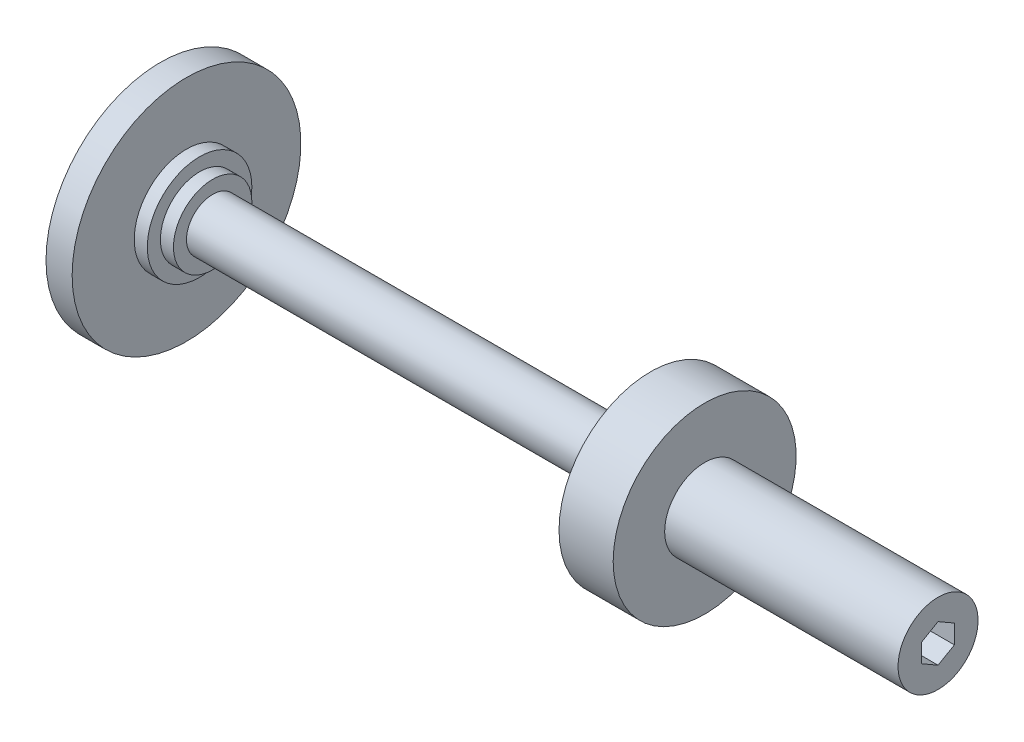
ISO-10303-21;
HEADER;
FILE_DESCRIPTION(('STEP AP214'),'2;1');
FILE_NAME('part.step','',(''),(''),'','','');
FILE_SCHEMA(('AUTOMOTIVE_DESIGN { 1 0 10303 214 1 1 1 1 }'));
ENDSEC;
DATA;
#1=APPLICATION_CONTEXT('core data for automotive mechanical design processes');
#2=APPLICATION_PROTOCOL_DEFINITION('international standard','automotive_design',2000,#1);
#3=PRODUCT_CONTEXT('',#1,'mechanical');
#4=PRODUCT('Part','Part','',(#3));
#5=PRODUCT_RELATED_PRODUCT_CATEGORY('part','',(#4));
#6=PRODUCT_DEFINITION_FORMATION('','',#4);
#7=PRODUCT_DEFINITION_CONTEXT('part definition',#1,'design');
#8=PRODUCT_DEFINITION('design','',#6,#7);
#9=PRODUCT_DEFINITION_SHAPE('','',#8);
#10=(LENGTH_UNIT() NAMED_UNIT(*) SI_UNIT(.MILLI.,.METRE.));
#11=(NAMED_UNIT(*) PLANE_ANGLE_UNIT() SI_UNIT($,.RADIAN.));
#12=(NAMED_UNIT(*) SI_UNIT($,.STERADIAN.) SOLID_ANGLE_UNIT());
#13=UNCERTAINTY_MEASURE_WITH_UNIT(LENGTH_MEASURE(1.E-05),#10,'distance_accuracy_value','');
#14=(GEOMETRIC_REPRESENTATION_CONTEXT(3) GLOBAL_UNCERTAINTY_ASSIGNED_CONTEXT((#13)) GLOBAL_UNIT_ASSIGNED_CONTEXT((#10,
#11,#12)) REPRESENTATION_CONTEXT('',''));
#15=CARTESIAN_POINT('',(0.,0.,0.));
#16=DIRECTION('',(0.,0.,1.));
#17=DIRECTION('',(1.,0.,0.));
#18=AXIS2_PLACEMENT_3D('',#15,#16,#17);
#19=CARTESIAN_POINT('',(-212.725,19.05,0.));
#20=DIRECTION('',(1.,0.,0.));
#21=DIRECTION('',(0.,0.,-1.));
#22=AXIS2_PLACEMENT_3D('',#19,#20,#21);
#23=PLANE('',#22);
#24=CARTESIAN_POINT('',(-212.725,0.,0.));
#25=DIRECTION('',(1.,0.,0.));
#26=DIRECTION('',(0.,0.,-1.));
#27=AXIS2_PLACEMENT_3D('',#24,#25,#26);
#28=CIRCLE('',#27,19.05);
#29=CARTESIAN_POINT('',(-212.725,0.,-19.05));
#30=VERTEX_POINT('',#29);
#31=EDGE_CURVE('E78',#30,#30,#28,.T.);
#32=ORIENTED_EDGE('',*,*,#31,.T.);
#33=EDGE_LOOP('',(#32));
#34=FACE_BOUND('',#33,.T.);
#35=CARTESIAN_POINT('',(-212.725,0.,0.));
#36=DIRECTION('',(1.,0.,0.));
#37=DIRECTION('',(0.,0.,-1.));
#38=AXIS2_PLACEMENT_3D('',#35,#36,#37);
#39=CIRCLE('',#38,12.7);
#40=CARTESIAN_POINT('',(-212.725,0.,-12.7));
#41=VERTEX_POINT('',#40);
#42=EDGE_CURVE('E11',#41,#41,#39,.T.);
#43=ORIENTED_EDGE('',*,*,#42,.F.);
#44=EDGE_LOOP('',(#43));
#45=FACE_BOUND('',#44,.T.);
#46=ADVANCED_FACE('F49',(#34,#45),#23,.T.);
#47=CARTESIAN_POINT('',(-254.,0.,0.));
#48=DIRECTION('',(1.,0.,0.));
#49=DIRECTION('',(0.,0.,-1.));
#50=AXIS2_PLACEMENT_3D('',#47,#48,#49);
#51=CYLINDRICAL_SURFACE('',#50,12.7);
#52=ORIENTED_EDGE('',*,*,#42,.T.);
#53=EDGE_LOOP('',(#52));
#54=FACE_BOUND('',#53,.T.);
#55=CARTESIAN_POINT('',(-225.425,0.,0.));
#56=DIRECTION('',(1.,0.,0.));
#57=DIRECTION('',(0.,0.,-1.));
#58=AXIS2_PLACEMENT_3D('',#55,#56,#57);
#59=CIRCLE('',#58,12.7);
#60=CARTESIAN_POINT('',(-225.425,0.,-12.7));
#61=VERTEX_POINT('',#60);
#62=EDGE_CURVE('E56',#61,#61,#59,.T.);
#63=ORIENTED_EDGE('',*,*,#62,.F.);
#64=EDGE_LOOP('',(#63));
#65=FACE_BOUND('',#64,.T.);
#66=ADVANCED_FACE('F99',(#54,#65),#51,.F.);
#67=CARTESIAN_POINT('',(-225.425,12.7000000000002,0.));
#68=DIRECTION('',(-1.,0.,0.));
#69=DIRECTION('',(0.,0.,1.));
#70=AXIS2_PLACEMENT_3D('',#67,#68,#69);
#71=PLANE('',#70);
#72=ORIENTED_EDGE('',*,*,#62,.T.);
#73=EDGE_LOOP('',(#72));
#74=FACE_BOUND('',#73,.T.);
#75=CARTESIAN_POINT('',(-225.425,0.,0.));
#76=DIRECTION('',(1.,0.,0.));
#77=DIRECTION('',(0.,0.,-1.));
#78=AXIS2_PLACEMENT_3D('',#75,#76,#77);
#79=CIRCLE('',#78,25.4);
#80=CARTESIAN_POINT('',(-225.425,0.,-25.4));
#81=VERTEX_POINT('',#80);
#82=EDGE_CURVE('E62',#81,#81,#79,.T.);
#83=ORIENTED_EDGE('',*,*,#82,.F.);
#84=EDGE_LOOP('',(#83));
#85=FACE_BOUND('',#84,.T.);
#86=ADVANCED_FACE('F104',(#74,#85),#71,.T.);
#87=CARTESIAN_POINT('',(-254.,0.,0.));
#88=DIRECTION('',(1.,0.,0.));
#89=DIRECTION('',(0.,0.,-1.));
#90=AXIS2_PLACEMENT_3D('',#87,#88,#89);
#91=CYLINDRICAL_SURFACE('',#90,25.4);
#92=ORIENTED_EDGE('',*,*,#82,.T.);
#93=EDGE_LOOP('',(#92));
#94=FACE_BOUND('',#93,.T.);
#95=CARTESIAN_POINT('',(-219.075,0.,0.));
#96=DIRECTION('',(1.,0.,0.));
#97=DIRECTION('',(0.,0.,-1.));
#98=AXIS2_PLACEMENT_3D('',#95,#96,#97);
#99=CIRCLE('',#98,25.4);
#100=CARTESIAN_POINT('',(-219.075,0.,-25.4));
#101=VERTEX_POINT('',#100);
#102=EDGE_CURVE('E68',#101,#101,#99,.T.);
#103=ORIENTED_EDGE('',*,*,#102,.F.);
#104=EDGE_LOOP('',(#103));
#105=FACE_BOUND('',#104,.T.);
#106=ADVANCED_FACE('F95',(#94,#105),#91,.T.);
#107=CARTESIAN_POINT('',(-219.075,25.4000000000005,0.));
#108=DIRECTION('',(1.,0.,0.));
#109=DIRECTION('',(0.,0.,-1.));
#110=AXIS2_PLACEMENT_3D('',#107,#108,#109);
#111=PLANE('',#110);
#112=ORIENTED_EDGE('',*,*,#102,.T.);
#113=EDGE_LOOP('',(#112));
#114=FACE_BOUND('',#113,.T.);
#115=CARTESIAN_POINT('',(-219.075,0.,0.));
#116=DIRECTION('',(1.,0.,0.));
#117=DIRECTION('',(0.,0.,-1.));
#118=AXIS2_PLACEMENT_3D('',#115,#116,#117);
#119=CIRCLE('',#118,19.05);
#120=CARTESIAN_POINT('',(-219.075,0.,-19.05));
#121=VERTEX_POINT('',#120);
#122=EDGE_CURVE('E74',#121,#121,#119,.T.);
#123=ORIENTED_EDGE('',*,*,#122,.F.);
#124=EDGE_LOOP('',(#123));
#125=FACE_BOUND('',#124,.T.);
#126=ADVANCED_FACE('F88',(#114,#125),#111,.T.);
#127=CARTESIAN_POINT('',(-254.,0.,0.));
#128=DIRECTION('',(1.,0.,0.));
#129=DIRECTION('',(0.,0.,-1.));
#130=AXIS2_PLACEMENT_3D('',#127,#128,#129);
#131=CYLINDRICAL_SURFACE('',#130,19.05);
#132=ORIENTED_EDGE('',*,*,#122,.T.);
#133=EDGE_LOOP('',(#132));
#134=FACE_BOUND('',#133,.T.);
#135=ORIENTED_EDGE('',*,*,#31,.F.);
#136=EDGE_LOOP('',(#135));
#137=FACE_BOUND('',#136,.T.);
#138=ADVANCED_FACE('F86',(#134,#137),#131,.T.);
#139=CLOSED_SHELL('',(#46,#66,#86,#106,#126,#138));
#140=MANIFOLD_SOLID_BREP('B2',#139);
#141=CARTESIAN_POINT('',(-254.,0.,0.));
#142=DIRECTION('',(1.,0.,0.));
#143=DIRECTION('',(0.,0.,-1.));
#144=AXIS2_PLACEMENT_3D('',#141,#142,#143);
#145=CYLINDRICAL_SURFACE('',#144,12.7);
#146=CARTESIAN_POINT('',(-238.125,0.,0.));
#147=DIRECTION('',(1.,0.,0.));
#148=DIRECTION('',(0.,0.,-1.));
#149=AXIS2_PLACEMENT_3D('',#146,#147,#148);
#150=CIRCLE('',#149,12.7);
#151=CARTESIAN_POINT('',(-238.125,0.,-12.7));
#152=VERTEX_POINT('',#151);
#153=EDGE_CURVE('E48',#152,#152,#150,.T.);
#154=ORIENTED_EDGE('',*,*,#153,.T.);
#155=EDGE_LOOP('',(#154));
#156=FACE_BOUND('',#155,.T.);
#157=CARTESIAN_POINT('',(-250.825,0.,0.));
#158=DIRECTION('',(1.,0.,0.));
#159=DIRECTION('',(0.,0.,-1.));
#160=AXIS2_PLACEMENT_3D('',#157,#158,#159);
#161=CIRCLE('',#160,12.7);
#162=CARTESIAN_POINT('',(-250.825,0.,-12.7));
#163=VERTEX_POINT('',#162);
#164=EDGE_CURVE('E177',#163,#163,#161,.T.);
#165=ORIENTED_EDGE('',*,*,#164,.F.);
#166=EDGE_LOOP('',(#165));
#167=FACE_BOUND('',#166,.T.);
#168=ADVANCED_FACE('F148',(#156,#167),#145,.F.);
#169=CARTESIAN_POINT('',(-238.125,12.7000000000002,0.));
#170=DIRECTION('',(1.,0.,0.));
#171=DIRECTION('',(0.,0.,-1.));
#172=AXIS2_PLACEMENT_3D('',#169,#170,#171);
#173=PLANE('',#172);
#174=CARTESIAN_POINT('',(-238.125,0.,0.));
#175=DIRECTION('',(1.,0.,0.));
#176=DIRECTION('',(0.,0.,-1.));
#177=AXIS2_PLACEMENT_3D('',#174,#175,#176);
#178=CIRCLE('',#177,25.4);
#179=CARTESIAN_POINT('',(-238.125,0.,-25.4));
#180=VERTEX_POINT('',#179);
#181=EDGE_CURVE('E155',#180,#180,#178,.T.);
#182=ORIENTED_EDGE('',*,*,#181,.T.);
#183=EDGE_LOOP('',(#182));
#184=FACE_BOUND('',#183,.T.);
#185=ORIENTED_EDGE('',*,*,#153,.F.);
#186=EDGE_LOOP('',(#185));
#187=FACE_BOUND('',#186,.T.);
#188=ADVANCED_FACE('F187',(#184,#187),#173,.T.);
#189=CARTESIAN_POINT('',(-254.,0.,0.));
#190=DIRECTION('',(1.,0.,0.));
#191=DIRECTION('',(0.,0.,-1.));
#192=AXIS2_PLACEMENT_3D('',#189,#190,#191);
#193=CYLINDRICAL_SURFACE('',#192,25.4);
#194=CARTESIAN_POINT('',(-244.475,0.,0.));
#195=DIRECTION('',(1.,0.,0.));
#196=DIRECTION('',(0.,0.,-1.));
#197=AXIS2_PLACEMENT_3D('',#194,#195,#196);
#198=CIRCLE('',#197,25.4);
#199=CARTESIAN_POINT('',(-244.475,0.,-25.4));
#200=VERTEX_POINT('',#199);
#201=EDGE_CURVE('E161',#200,#200,#198,.T.);
#202=ORIENTED_EDGE('',*,*,#201,.T.);
#203=EDGE_LOOP('',(#202));
#204=FACE_BOUND('',#203,.T.);
#205=ORIENTED_EDGE('',*,*,#181,.F.);
#206=EDGE_LOOP('',(#205));
#207=FACE_BOUND('',#206,.T.);
#208=ADVANCED_FACE('F192',(#204,#207),#193,.T.);
#209=CARTESIAN_POINT('',(-244.475,25.4000000000005,0.));
#210=DIRECTION('',(-1.,0.,0.));
#211=DIRECTION('',(0.,0.,1.));
#212=AXIS2_PLACEMENT_3D('',#209,#210,#211);
#213=PLANE('',#212);
#214=CARTESIAN_POINT('',(-244.475,0.,0.));
#215=DIRECTION('',(1.,0.,0.));
#216=DIRECTION('',(0.,0.,-1.));
#217=AXIS2_PLACEMENT_3D('',#214,#215,#216);
#218=CIRCLE('',#217,19.05);
#219=CARTESIAN_POINT('',(-244.475,0.,-19.05));
#220=VERTEX_POINT('',#219);
#221=EDGE_CURVE('E167',#220,#220,#218,.T.);
#222=ORIENTED_EDGE('',*,*,#221,.T.);
#223=EDGE_LOOP('',(#222));
#224=FACE_BOUND('',#223,.T.);
#225=ORIENTED_EDGE('',*,*,#201,.F.);
#226=EDGE_LOOP('',(#225));
#227=FACE_BOUND('',#226,.T.);
#228=ADVANCED_FACE('F197',(#224,#227),#213,.T.);
#229=CARTESIAN_POINT('',(-254.,0.,0.));
#230=DIRECTION('',(1.,0.,0.));
#231=DIRECTION('',(0.,0.,-1.));
#232=AXIS2_PLACEMENT_3D('',#229,#230,#231);
#233=CYLINDRICAL_SURFACE('',#232,19.05);
#234=CARTESIAN_POINT('',(-250.825,0.,0.));
#235=DIRECTION('',(1.,0.,0.));
#236=DIRECTION('',(0.,0.,-1.));
#237=AXIS2_PLACEMENT_3D('',#234,#235,#236);
#238=CIRCLE('',#237,19.05);
#239=CARTESIAN_POINT('',(-250.825,0.,-19.05));
#240=VERTEX_POINT('',#239);
#241=EDGE_CURVE('E173',#240,#240,#238,.T.);
#242=ORIENTED_EDGE('',*,*,#241,.T.);
#243=EDGE_LOOP('',(#242));
#244=FACE_BOUND('',#243,.T.);
#245=ORIENTED_EDGE('',*,*,#221,.F.);
#246=EDGE_LOOP('',(#245));
#247=FACE_BOUND('',#246,.T.);
#248=ADVANCED_FACE('F204',(#244,#247),#233,.T.);
#249=CARTESIAN_POINT('',(-250.825,19.05,0.));
#250=DIRECTION('',(-1.,0.,0.));
#251=DIRECTION('',(0.,0.,1.));
#252=AXIS2_PLACEMENT_3D('',#249,#250,#251);
#253=PLANE('',#252);
#254=ORIENTED_EDGE('',*,*,#164,.T.);
#255=EDGE_LOOP('',(#254));
#256=FACE_BOUND('',#255,.T.);
#257=ORIENTED_EDGE('',*,*,#241,.F.);
#258=EDGE_LOOP('',(#257));
#259=FACE_BOUND('',#258,.T.);
#260=ADVANCED_FACE('F183',(#256,#259),#253,.T.);
#261=CLOSED_SHELL('',(#168,#188,#208,#228,#248,#260));
#262=MANIFOLD_SOLID_BREP('B6',#261);
#263=CARTESIAN_POINT('',(-225.425,0.,0.));
#264=DIRECTION('',(-1.,0.,0.));
#265=DIRECTION('',(0.,0.,1.));
#266=AXIS2_PLACEMENT_3D('',#263,#264,#265);
#267=CYLINDRICAL_SURFACE('',#266,55.5625);
#268=CARTESIAN_POINT('',(-225.425,0.,0.));
#269=DIRECTION('',(-1.,0.,0.));
#270=DIRECTION('',(0.,0.,1.));
#271=AXIS2_PLACEMENT_3D('',#268,#269,#270);
#272=CIRCLE('',#271,55.5625);
#273=CARTESIAN_POINT('',(-225.425,0.,55.5625000000001));
#274=VERTEX_POINT('',#273);
#275=EDGE_CURVE('E147',#274,#274,#272,.T.);
#276=ORIENTED_EDGE('',*,*,#275,.T.);
#277=EDGE_LOOP('',(#276));
#278=FACE_BOUND('',#277,.T.);
#279=CARTESIAN_POINT('',(-238.125,0.,0.));
#280=DIRECTION('',(-1.,0.,0.));
#281=DIRECTION('',(0.,0.,1.));
#282=AXIS2_PLACEMENT_3D('',#279,#280,#281);
#283=CIRCLE('',#282,55.5625);
#284=CARTESIAN_POINT('',(-238.125,0.,55.5625000000001));
#285=VERTEX_POINT('',#284);
#286=EDGE_CURVE('E251',#285,#285,#283,.T.);
#287=ORIENTED_EDGE('',*,*,#286,.F.);
#288=EDGE_LOOP('',(#287));
#289=FACE_BOUND('',#288,.T.);
#290=ADVANCED_FACE('F248',(#278,#289),#267,.T.);
#291=CARTESIAN_POINT('',(-225.425,0.,0.));
#292=DIRECTION('',(-1.,0.,0.));
#293=DIRECTION('',(0.,0.,1.));
#294=AXIS2_PLACEMENT_3D('',#291,#292,#293);
#295=PLANE('',#294);
#296=CARTESIAN_POINT('',(-225.425,0.,0.));
#297=DIRECTION('',(-1.,0.,0.));
#298=DIRECTION('',(0.,0.,1.));
#299=AXIS2_PLACEMENT_3D('',#296,#297,#298);
#300=CIRCLE('',#299,12.7);
#301=CARTESIAN_POINT('',(-225.425,0.,12.7));
#302=VERTEX_POINT('',#301);
#303=EDGE_CURVE('E261',#302,#302,#300,.T.);
#304=ORIENTED_EDGE('',*,*,#303,.T.);
#305=EDGE_LOOP('',(#304));
#306=FACE_BOUND('',#305,.T.);
#307=ORIENTED_EDGE('',*,*,#275,.F.);
#308=EDGE_LOOP('',(#307));
#309=FACE_BOUND('',#308,.T.);
#310=ADVANCED_FACE('F272',(#306,#309),#295,.F.);
#311=CARTESIAN_POINT('',(-238.125,0.,0.));
#312=DIRECTION('',(-1.,0.,0.));
#313=DIRECTION('',(0.,0.,1.));
#314=AXIS2_PLACEMENT_3D('',#311,#312,#313);
#315=PLANE('',#314);
#316=CARTESIAN_POINT('',(-238.125,0.,0.));
#317=DIRECTION('',(-1.,0.,0.));
#318=DIRECTION('',(0.,0.,1.));
#319=AXIS2_PLACEMENT_3D('',#316,#317,#318);
#320=CIRCLE('',#319,12.7);
#321=CARTESIAN_POINT('',(-238.125,0.,12.7));
#322=VERTEX_POINT('',#321);
#323=EDGE_CURVE('E263',#322,#322,#320,.T.);
#324=ORIENTED_EDGE('',*,*,#323,.F.);
#325=EDGE_LOOP('',(#324));
#326=FACE_BOUND('',#325,.T.);
#327=ORIENTED_EDGE('',*,*,#286,.T.);
#328=EDGE_LOOP('',(#327));
#329=FACE_BOUND('',#328,.T.);
#330=ADVANCED_FACE('F278',(#326,#329),#315,.T.);
#331=CARTESIAN_POINT('',(-225.425,0.,0.));
#332=DIRECTION('',(-1.,0.,0.));
#333=DIRECTION('',(0.,0.,1.));
#334=AXIS2_PLACEMENT_3D('',#331,#332,#333);
#335=CYLINDRICAL_SURFACE('',#334,12.7);
#336=ORIENTED_EDGE('',*,*,#303,.F.);
#337=EDGE_LOOP('',(#336));
#338=FACE_BOUND('',#337,.T.);
#339=ORIENTED_EDGE('',*,*,#323,.T.);
#340=EDGE_LOOP('',(#339));
#341=FACE_BOUND('',#340,.T.);
#342=ADVANCED_FACE('F275',(#338,#341),#335,.F.);
#343=CLOSED_SHELL('',(#290,#310,#330,#342));
#344=MANIFOLD_SOLID_BREP('B43',#343);
#345=CARTESIAN_POINT('',(139.7,0.,0.));
#346=DIRECTION('',(-1.,0.,0.));
#347=DIRECTION('',(0.,0.,1.));
#348=AXIS2_PLACEMENT_3D('',#345,#346,#347);
#349=PLANE('',#348);
#350=DIRECTION('',(0.,-0.500000000000001,0.86602540378444));
#351=VECTOR('',#350,1.);
#352=CARTESIAN_POINT('',(139.7,9.16543552338545,-6.66133814775094E-13));
#353=LINE('',#352,#351);
#354=CARTESIAN_POINT('',(139.7,9.16543552338545,-6.66133814775094E-13));
#355=VERTEX_POINT('',#354);
#356=CARTESIAN_POINT('',(139.7,4.58271776169328,7.93749999999993));
#357=VERTEX_POINT('',#356);
#358=EDGE_CURVE('E406',#355,#357,#353,.T.);
#359=ORIENTED_EDGE('',*,*,#358,.F.);
#360=DIRECTION('',(0.,0.5,0.86602540378444));
#361=VECTOR('',#360,1.);
#362=CARTESIAN_POINT('',(139.7,4.58271776169328,-7.9375000000006));
#363=LINE('',#362,#361);
#364=CARTESIAN_POINT('',(139.7,4.58271776169328,-7.9375000000006));
#365=VERTEX_POINT('',#364);
#366=EDGE_CURVE('E325',#365,#355,#363,.T.);
#367=ORIENTED_EDGE('',*,*,#366,.F.);
#368=DIRECTION('',(0.,1.,0.));
#369=VECTOR('',#368,1.);
#370=CARTESIAN_POINT('',(139.7,-4.58271776169261,-7.9375000000006));
#371=LINE('',#370,#369);
#372=CARTESIAN_POINT('',(139.7,-4.58271776169261,-7.9375000000006));
#373=VERTEX_POINT('',#372);
#374=EDGE_CURVE('E419',#373,#365,#371,.T.);
#375=ORIENTED_EDGE('',*,*,#374,.F.);
#376=DIRECTION('',(0.,0.500000000000001,-0.86602540378444));
#377=VECTOR('',#376,1.);
#378=CARTESIAN_POINT('',(139.7,-9.16543552338478,0.));
#379=LINE('',#378,#377);
#380=CARTESIAN_POINT('',(139.7,-9.16543552338478,0.));
#381=VERTEX_POINT('',#380);
#382=EDGE_CURVE('E416',#381,#373,#379,.T.);
#383=ORIENTED_EDGE('',*,*,#382,.F.);
#384=DIRECTION('',(0.,-0.5,-0.86602540378444));
#385=VECTOR('',#384,1.);
#386=CARTESIAN_POINT('',(139.7,-4.58271776169261,7.93749999999993));
#387=LINE('',#386,#385);
#388=CARTESIAN_POINT('',(139.7,-4.58271776169261,7.93749999999993));
#389=VERTEX_POINT('',#388);
#390=EDGE_CURVE('E373',#389,#381,#387,.T.);
#391=ORIENTED_EDGE('',*,*,#390,.F.);
#392=DIRECTION('',(0.,-1.,0.));
#393=VECTOR('',#392,1.);
#394=CARTESIAN_POINT('',(139.7,4.58271776169328,7.93749999999993));
#395=LINE('',#394,#393);
#396=EDGE_CURVE('E410',#357,#389,#395,.T.);
#397=ORIENTED_EDGE('',*,*,#396,.F.);
#398=EDGE_LOOP('',(#359,#367,#375,#383,#391,#397));
#399=FACE_BOUND('',#398,.T.);
#400=CARTESIAN_POINT('',(139.7,0.,0.));
#401=DIRECTION('',(-1.,0.,0.));
#402=DIRECTION('',(0.,0.,1.));
#403=AXIS2_PLACEMENT_3D('',#400,#401,#402);
#404=CIRCLE('',#403,19.4437);
#405=CARTESIAN_POINT('',(139.7,0.,19.4437));
#406=VERTEX_POINT('',#405);
#407=EDGE_CURVE('E312',#406,#406,#404,.T.);
#408=ORIENTED_EDGE('',*,*,#407,.F.);
#409=EDGE_LOOP('',(#408));
#410=FACE_BOUND('',#409,.T.);
#411=ADVANCED_FACE('F309',(#399,#410),#349,.F.);
#412=CARTESIAN_POINT('',(0.,0.,0.));
#413=DIRECTION('',(-1.,0.,0.));
#414=DIRECTION('',(0.,0.,1.));
#415=AXIS2_PLACEMENT_3D('',#412,#413,#414);
#416=CYLINDRICAL_SURFACE('',#415,19.4437);
#417=CARTESIAN_POINT('',(26.3144,0.,0.));
#418=DIRECTION('',(-1.,0.,0.));
#419=DIRECTION('',(0.,0.,1.));
#420=AXIS2_PLACEMENT_3D('',#417,#418,#419);
#421=CIRCLE('',#420,19.4437);
#422=CARTESIAN_POINT('',(26.3144,0.,19.4437));
#423=VERTEX_POINT('',#422);
#424=EDGE_CURVE('E445',#423,#423,#421,.T.);
#425=ORIENTED_EDGE('',*,*,#424,.F.);
#426=EDGE_LOOP('',(#425));
#427=FACE_BOUND('',#426,.T.);
#428=ORIENTED_EDGE('',*,*,#407,.T.);
#429=EDGE_LOOP('',(#428));
#430=FACE_BOUND('',#429,.T.);
#431=ADVANCED_FACE('F456',(#427,#430),#416,.T.);
#432=CARTESIAN_POINT('',(26.3144,19.4437000000007,-6.66133814775094E-13));
#433=DIRECTION('',(-1.,0.,0.));
#434=DIRECTION('',(0.,0.,1.));
#435=AXIS2_PLACEMENT_3D('',#432,#433,#434);
#436=PLANE('',#435);
#437=CARTESIAN_POINT('',(26.3144,0.,0.));
#438=DIRECTION('',(-1.,0.,0.));
#439=DIRECTION('',(0.,0.,1.));
#440=AXIS2_PLACEMENT_3D('',#437,#438,#439);
#441=CIRCLE('',#440,44.45);
#442=CARTESIAN_POINT('',(26.3144,0.,44.4500000000001));
#443=VERTEX_POINT('',#442);
#444=EDGE_CURVE('E442',#443,#443,#441,.T.);
#445=ORIENTED_EDGE('',*,*,#444,.F.);
#446=EDGE_LOOP('',(#445));
#447=FACE_BOUND('',#446,.T.);
#448=ORIENTED_EDGE('',*,*,#424,.T.);
#449=EDGE_LOOP('',(#448));
#450=FACE_BOUND('',#449,.T.);
#451=ADVANCED_FACE('F464',(#447,#450),#436,.F.);
#452=CARTESIAN_POINT('',(0.,0.,0.));
#453=DIRECTION('',(-1.,0.,0.));
#454=DIRECTION('',(0.,0.,1.));
#455=AXIS2_PLACEMENT_3D('',#452,#453,#454);
#456=CYLINDRICAL_SURFACE('',#455,44.45);
#457=CARTESIAN_POINT('',(0.,0.,0.));
#458=DIRECTION('',(-1.,0.,0.));
#459=DIRECTION('',(0.,0.,1.));
#460=AXIS2_PLACEMENT_3D('',#457,#458,#459);
#461=CIRCLE('',#460,44.45);
#462=CARTESIAN_POINT('',(0.,0.,44.4500000000001));
#463=VERTEX_POINT('',#462);
#464=EDGE_CURVE('E437',#463,#463,#461,.T.);
#465=ORIENTED_EDGE('',*,*,#464,.F.);
#466=EDGE_LOOP('',(#465));
#467=FACE_BOUND('',#466,.T.);
#468=ORIENTED_EDGE('',*,*,#444,.T.);
#469=EDGE_LOOP('',(#468));
#470=FACE_BOUND('',#469,.T.);
#471=ADVANCED_FACE('F506',(#467,#470),#456,.T.);
#472=CARTESIAN_POINT('',(0.,44.4500000000001,0.));
#473=DIRECTION('',(1.,0.,0.));
#474=DIRECTION('',(0.,0.,-1.));
#475=AXIS2_PLACEMENT_3D('',#472,#473,#474);
#476=PLANE('',#475);
#477=CARTESIAN_POINT('',(0.,0.,0.));
#478=DIRECTION('',(-1.,0.,0.));
#479=DIRECTION('',(0.,0.,1.));
#480=AXIS2_PLACEMENT_3D('',#477,#478,#479);
#481=CIRCLE('',#480,12.7);
#482=CARTESIAN_POINT('',(0.,0.,12.7));
#483=VERTEX_POINT('',#482);
#484=EDGE_CURVE('E246',#483,#483,#481,.T.);
#485=ORIENTED_EDGE('',*,*,#484,.F.);
#486=EDGE_LOOP('',(#485));
#487=FACE_BOUND('',#486,.T.);
#488=ORIENTED_EDGE('',*,*,#464,.T.);
#489=EDGE_LOOP('',(#488));
#490=FACE_BOUND('',#489,.T.);
#491=ADVANCED_FACE('F502',(#487,#490),#476,.F.);
#492=CARTESIAN_POINT('',(-254.,0.,0.));
#493=DIRECTION('',(1.,0.,0.));
#494=DIRECTION('',(0.,0.,-1.));
#495=AXIS2_PLACEMENT_3D('',#492,#493,#494);
#496=CYLINDRICAL_SURFACE('',#495,12.7);
#497=CARTESIAN_POINT('',(-254.,0.,0.));
#498=DIRECTION('',(-1.,0.,0.));
#499=DIRECTION('',(0.,0.,1.));
#500=AXIS2_PLACEMENT_3D('',#497,#498,#499);
#501=CIRCLE('',#500,12.7);
#502=CARTESIAN_POINT('',(-254.,0.,12.7));
#503=VERTEX_POINT('',#502);
#504=EDGE_CURVE('E425',#503,#503,#501,.T.);
#505=ORIENTED_EDGE('',*,*,#504,.F.);
#506=EDGE_LOOP('',(#505));
#507=FACE_BOUND('',#506,.T.);
#508=ORIENTED_EDGE('',*,*,#484,.T.);
#509=EDGE_LOOP('',(#508));
#510=FACE_BOUND('',#509,.T.);
#511=ADVANCED_FACE('F494',(#507,#510),#496,.T.);
#512=CARTESIAN_POINT('',(-254.,0.,0.));
#513=DIRECTION('',(-1.,0.,0.));
#514=DIRECTION('',(0.,0.,1.));
#515=AXIS2_PLACEMENT_3D('',#512,#513,#514);
#516=PLANE('',#515);
#517=ORIENTED_EDGE('',*,*,#504,.T.);
#518=EDGE_LOOP('',(#517));
#519=FACE_BOUND('',#518,.T.);
#520=ADVANCED_FACE('F486',(#519),#516,.T.);
#521=CARTESIAN_POINT('',(76.2,4.58271776169328,-7.9375000000006));
#522=DIRECTION('',(0.,0.86602540378444,-0.5));
#523=DIRECTION('',(0.,0.5,0.86602540378444));
#524=AXIS2_PLACEMENT_3D('',#521,#522,#523);
#525=PLANE('',#524);
#526=ORIENTED_EDGE('',*,*,#366,.T.);
#527=DIRECTION('',(1.,0.,0.));
#528=VECTOR('',#527,1.);
#529=CARTESIAN_POINT('',(76.2,9.16543552338545,-6.66133814775094E-13));
#530=LINE('',#529,#528);
#531=CARTESIAN_POINT('',(76.2,9.16543552338545,-6.66133814775094E-13));
#532=VERTEX_POINT('',#531);
#533=EDGE_CURVE('E355',#532,#355,#530,.T.);
#534=ORIENTED_EDGE('',*,*,#533,.F.);
#535=DIRECTION('',(0.,0.5,0.86602540378444));
#536=VECTOR('',#535,1.);
#537=CARTESIAN_POINT('',(76.2,4.58271776169328,-7.9375000000006));
#538=LINE('',#537,#536);
#539=CARTESIAN_POINT('',(76.2,4.58271776169328,-7.9375000000006));
#540=VERTEX_POINT('',#539);
#541=EDGE_CURVE('E422',#540,#532,#538,.T.);
#542=ORIENTED_EDGE('',*,*,#541,.F.);
#543=DIRECTION('',(1.,0.,0.));
#544=VECTOR('',#543,1.);
#545=CARTESIAN_POINT('',(76.2,4.58271776169328,-7.9375000000006));
#546=LINE('',#545,#544);
#547=EDGE_CURVE('E333',#540,#365,#546,.T.);
#548=ORIENTED_EDGE('',*,*,#547,.T.);
#549=EDGE_LOOP('',(#526,#534,#542,#548));
#550=FACE_BOUND('',#549,.T.);
#551=ADVANCED_FACE('F483',(#550),#525,.F.);
#552=CARTESIAN_POINT('',(76.2,-4.58271776169261,-7.9375000000006));
#553=DIRECTION('',(0.,0.,-1.));
#554=DIRECTION('',(0.,1.,0.));
#555=AXIS2_PLACEMENT_3D('',#552,#553,#554);
#556=PLANE('',#555);
#557=ORIENTED_EDGE('',*,*,#374,.T.);
#558=ORIENTED_EDGE('',*,*,#547,.F.);
#559=DIRECTION('',(0.,1.,0.));
#560=VECTOR('',#559,1.);
#561=CARTESIAN_POINT('',(76.2,-4.58271776169261,-7.9375000000006));
#562=LINE('',#561,#560);
#563=CARTESIAN_POINT('',(76.2,-4.58271776169261,-7.9375000000006));
#564=VERTEX_POINT('',#563);
#565=EDGE_CURVE('E387',#564,#540,#562,.T.);
#566=ORIENTED_EDGE('',*,*,#565,.F.);
#567=DIRECTION('',(1.,0.,0.));
#568=VECTOR('',#567,1.);
#569=CARTESIAN_POINT('',(76.2,-4.58271776169261,-7.9375000000006));
#570=LINE('',#569,#568);
#571=EDGE_CURVE('E378',#564,#373,#570,.T.);
#572=ORIENTED_EDGE('',*,*,#571,.T.);
#573=EDGE_LOOP('',(#557,#558,#566,#572));
#574=FACE_BOUND('',#573,.T.);
#575=ADVANCED_FACE('F485',(#574),#556,.F.);
#576=CARTESIAN_POINT('',(76.2,-9.16543552338478,0.));
#577=DIRECTION('',(0.,-0.86602540378444,-0.500000000000001));
#578=DIRECTION('',(0.,0.500000000000001,-0.86602540378444));
#579=AXIS2_PLACEMENT_3D('',#576,#577,#578);
#580=PLANE('',#579);
#581=ORIENTED_EDGE('',*,*,#382,.T.);
#582=ORIENTED_EDGE('',*,*,#571,.F.);
#583=DIRECTION('',(0.,0.500000000000001,-0.86602540378444));
#584=VECTOR('',#583,1.);
#585=CARTESIAN_POINT('',(76.2,-9.16543552338478,0.));
#586=LINE('',#585,#584);
#587=CARTESIAN_POINT('',(76.2,-9.16543552338478,0.));
#588=VERTEX_POINT('',#587);
#589=EDGE_CURVE('E382',#588,#564,#586,.T.);
#590=ORIENTED_EDGE('',*,*,#589,.F.);
#591=DIRECTION('',(1.,0.,0.));
#592=VECTOR('',#591,1.);
#593=CARTESIAN_POINT('',(76.2,-9.16543552338478,0.));
#594=LINE('',#593,#592);
#595=EDGE_CURVE('E366',#588,#381,#594,.T.);
#596=ORIENTED_EDGE('',*,*,#595,.T.);
#597=EDGE_LOOP('',(#581,#582,#590,#596));
#598=FACE_BOUND('',#597,.T.);
#599=ADVANCED_FACE('F383',(#598),#580,.F.);
#600=CARTESIAN_POINT('',(76.2,-4.58271776169261,7.93749999999993));
#601=DIRECTION('',(0.,-0.86602540378444,0.5));
#602=DIRECTION('',(0.,-0.5,-0.86602540378444));
#603=AXIS2_PLACEMENT_3D('',#600,#601,#602);
#604=PLANE('',#603);
#605=ORIENTED_EDGE('',*,*,#390,.T.);
#606=ORIENTED_EDGE('',*,*,#595,.F.);
#607=DIRECTION('',(0.,-0.5,-0.86602540378444));
#608=VECTOR('',#607,1.);
#609=CARTESIAN_POINT('',(76.2,-4.58271776169261,7.93749999999993));
#610=LINE('',#609,#608);
#611=CARTESIAN_POINT('',(76.2,-4.58271776169261,7.93749999999993));
#612=VERTEX_POINT('',#611);
#613=EDGE_CURVE('E370',#612,#588,#610,.T.);
#614=ORIENTED_EDGE('',*,*,#613,.F.);
#615=DIRECTION('',(1.,0.,0.));
#616=VECTOR('',#615,1.);
#617=CARTESIAN_POINT('',(76.2,-4.58271776169261,7.93749999999993));
#618=LINE('',#617,#616);
#619=EDGE_CURVE('E379',#612,#389,#618,.T.);
#620=ORIENTED_EDGE('',*,*,#619,.T.);
#621=EDGE_LOOP('',(#605,#606,#614,#620));
#622=FACE_BOUND('',#621,.T.);
#623=ADVANCED_FACE('F368',(#622),#604,.F.);
#624=CARTESIAN_POINT('',(76.2,4.58271776169328,7.93749999999993));
#625=DIRECTION('',(0.,0.,1.));
#626=DIRECTION('',(0.,-1.,0.));
#627=AXIS2_PLACEMENT_3D('',#624,#625,#626);
#628=PLANE('',#627);
#629=ORIENTED_EDGE('',*,*,#396,.T.);
#630=ORIENTED_EDGE('',*,*,#619,.F.);
#631=DIRECTION('',(0.,-1.,0.));
#632=VECTOR('',#631,1.);
#633=CARTESIAN_POINT('',(76.2,4.58271776169328,7.93749999999993));
#634=LINE('',#633,#632);
#635=CARTESIAN_POINT('',(76.2,4.58271776169328,7.93749999999993));
#636=VERTEX_POINT('',#635);
#637=EDGE_CURVE('E393',#636,#612,#634,.T.);
#638=ORIENTED_EDGE('',*,*,#637,.F.);
#639=DIRECTION('',(1.,0.,0.));
#640=VECTOR('',#639,1.);
#641=CARTESIAN_POINT('',(76.2,4.58271776169328,7.93749999999993));
#642=LINE('',#641,#640);
#643=EDGE_CURVE('E430',#636,#357,#642,.T.);
#644=ORIENTED_EDGE('',*,*,#643,.T.);
#645=EDGE_LOOP('',(#629,#630,#638,#644));
#646=FACE_BOUND('',#645,.T.);
#647=ADVANCED_FACE('F553',(#646),#628,.F.);
#648=CARTESIAN_POINT('',(76.2,9.16543552338545,-6.66133814775094E-13));
#649=DIRECTION('',(0.,0.86602540378444,0.500000000000001));
#650=DIRECTION('',(0.,-0.500000000000001,0.86602540378444));
#651=AXIS2_PLACEMENT_3D('',#648,#649,#650);
#652=PLANE('',#651);
#653=ORIENTED_EDGE('',*,*,#358,.T.);
#654=ORIENTED_EDGE('',*,*,#643,.F.);
#655=DIRECTION('',(0.,-0.500000000000001,0.86602540378444));
#656=VECTOR('',#655,1.);
#657=CARTESIAN_POINT('',(76.2,9.16543552338545,-6.66133814775094E-13));
#658=LINE('',#657,#656);
#659=EDGE_CURVE('E398',#532,#636,#658,.T.);
#660=ORIENTED_EDGE('',*,*,#659,.F.);
#661=ORIENTED_EDGE('',*,*,#533,.T.);
#662=EDGE_LOOP('',(#653,#654,#660,#661));
#663=FACE_BOUND('',#662,.T.);
#664=ADVANCED_FACE('F470',(#663),#652,.F.);
#665=CARTESIAN_POINT('',(76.2,0.,0.));
#666=DIRECTION('',(1.,0.,0.));
#667=DIRECTION('',(0.,0.,-1.));
#668=AXIS2_PLACEMENT_3D('',#665,#666,#667);
#669=PLANE('',#668);
#670=ORIENTED_EDGE('',*,*,#541,.T.);
#671=ORIENTED_EDGE('',*,*,#659,.T.);
#672=ORIENTED_EDGE('',*,*,#637,.T.);
#673=ORIENTED_EDGE('',*,*,#613,.T.);
#674=ORIENTED_EDGE('',*,*,#589,.T.);
#675=ORIENTED_EDGE('',*,*,#565,.T.);
#676=EDGE_LOOP('',(#670,#671,#672,#673,#674,#675));
#677=FACE_BOUND('',#676,.T.);
#678=ADVANCED_FACE('F390',(#677),#669,.T.);
#679=CLOSED_SHELL('',(#411,#431,#451,#471,#491,#511,#520,#551,#575,#599,#623,#647,#664,#678));
#680=MANIFOLD_SOLID_BREP('B142',#679);
#681=ADVANCED_BREP_SHAPE_REPRESENTATION('',(#18,#140,#262,#344,#680),#14);
#682=SHAPE_DEFINITION_REPRESENTATION(#9,#681);
ENDSEC;
END-ISO-10303-21;
